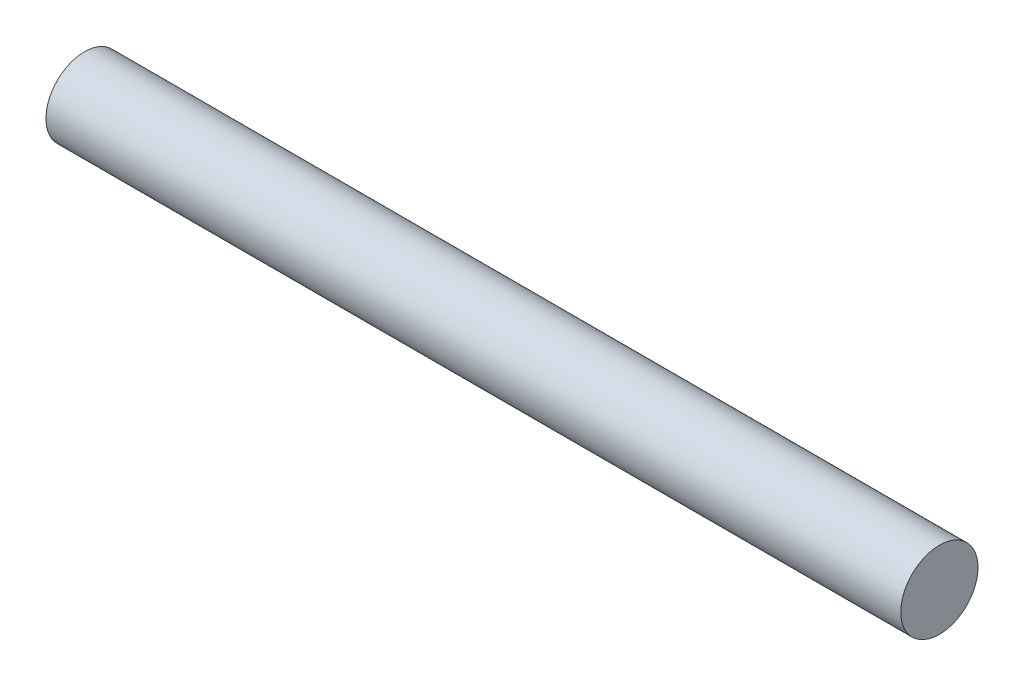
ISO-10303-21;
HEADER;
FILE_DESCRIPTION(('STEP AP214'),'2;1');
FILE_NAME('part.step','',(''),(''),'','','');
FILE_SCHEMA(('AUTOMOTIVE_DESIGN { 1 0 10303 214 1 1 1 1 }'));
ENDSEC;
DATA;
#1=APPLICATION_CONTEXT('core data for automotive mechanical design processes');
#2=APPLICATION_PROTOCOL_DEFINITION('international standard','automotive_design',2000,#1);
#3=PRODUCT_CONTEXT('',#1,'mechanical');
#4=PRODUCT('Part','Part','',(#3));
#5=PRODUCT_RELATED_PRODUCT_CATEGORY('part','',(#4));
#6=PRODUCT_DEFINITION_FORMATION('','',#4);
#7=PRODUCT_DEFINITION_CONTEXT('part definition',#1,'design');
#8=PRODUCT_DEFINITION('design','',#6,#7);
#9=PRODUCT_DEFINITION_SHAPE('','',#8);
#10=(LENGTH_UNIT() NAMED_UNIT(*) SI_UNIT(.MILLI.,.METRE.));
#11=(NAMED_UNIT(*) PLANE_ANGLE_UNIT() SI_UNIT($,.RADIAN.));
#12=(NAMED_UNIT(*) SI_UNIT($,.STERADIAN.) SOLID_ANGLE_UNIT());
#13=UNCERTAINTY_MEASURE_WITH_UNIT(LENGTH_MEASURE(1.E-05),#10,'distance_accuracy_value','');
#14=(GEOMETRIC_REPRESENTATION_CONTEXT(3) GLOBAL_UNCERTAINTY_ASSIGNED_CONTEXT((#13)) GLOBAL_UNIT_ASSIGNED_CONTEXT((#10,
#11,#12)) REPRESENTATION_CONTEXT('',''));
#15=CARTESIAN_POINT('',(0.,0.,0.));
#16=DIRECTION('',(0.,0.,1.));
#17=DIRECTION('',(1.,0.,0.));
#18=AXIS2_PLACEMENT_3D('',#15,#16,#17);
#19=CARTESIAN_POINT('',(498.,0.,0.));
#20=DIRECTION('',(-1.,0.,0.));
#21=DIRECTION('',(0.,0.,1.));
#22=AXIS2_PLACEMENT_3D('',#19,#20,#21);
#23=CYLINDRICAL_SURFACE('',#22,22.5);
#24=CARTESIAN_POINT('',(498.,0.,0.));
#25=DIRECTION('',(1.,0.,0.));
#26=DIRECTION('',(0.,0.,-1.));
#27=AXIS2_PLACEMENT_3D('',#24,#25,#26);
#28=CIRCLE('',#27,22.5);
#29=CARTESIAN_POINT('',(498.,0.,-22.5));
#30=VERTEX_POINT('',#29);
#31=EDGE_CURVE('E10',#30,#30,#28,.T.);
#32=ORIENTED_EDGE('',*,*,#31,.F.);
#33=EDGE_LOOP('',(#32));
#34=FACE_BOUND('',#33,.T.);
#35=CARTESIAN_POINT('',(0.,0.,0.));
#36=DIRECTION('',(1.,0.,0.));
#37=DIRECTION('',(0.,0.,-1.));
#38=AXIS2_PLACEMENT_3D('',#35,#36,#37);
#39=CIRCLE('',#38,22.5);
#40=CARTESIAN_POINT('',(0.,0.,-22.5));
#41=VERTEX_POINT('',#40);
#42=EDGE_CURVE('E33',#41,#41,#39,.T.);
#43=ORIENTED_EDGE('',*,*,#42,.T.);
#44=EDGE_LOOP('',(#43));
#45=FACE_BOUND('',#44,.T.);
#46=ADVANCED_FACE('F30',(#34,#45),#23,.T.);
#47=CARTESIAN_POINT('',(498.,0.,0.));
#48=DIRECTION('',(1.,0.,0.));
#49=DIRECTION('',(0.,0.,-1.));
#50=AXIS2_PLACEMENT_3D('',#47,#48,#49);
#51=PLANE('',#50);
#52=ORIENTED_EDGE('',*,*,#31,.T.);
#53=EDGE_LOOP('',(#52));
#54=FACE_BOUND('',#53,.T.);
#55=ADVANCED_FACE('F45',(#54),#51,.T.);
#56=CARTESIAN_POINT('',(0.,0.,0.));
#57=DIRECTION('',(1.,0.,0.));
#58=DIRECTION('',(0.,0.,-1.));
#59=AXIS2_PLACEMENT_3D('',#56,#57,#58);
#60=PLANE('',#59);
#61=ORIENTED_EDGE('',*,*,#42,.F.);
#62=EDGE_LOOP('',(#61));
#63=FACE_BOUND('',#62,.T.);
#64=ADVANCED_FACE('F43',(#63),#60,.F.);
#65=CLOSED_SHELL('',(#46,#55,#64));
#66=MANIFOLD_SOLID_BREP('B2',#65);
#67=ADVANCED_BREP_SHAPE_REPRESENTATION('',(#18,#66),#14);
#68=SHAPE_DEFINITION_REPRESENTATION(#9,#67);
ENDSEC;
END-ISO-10303-21;
